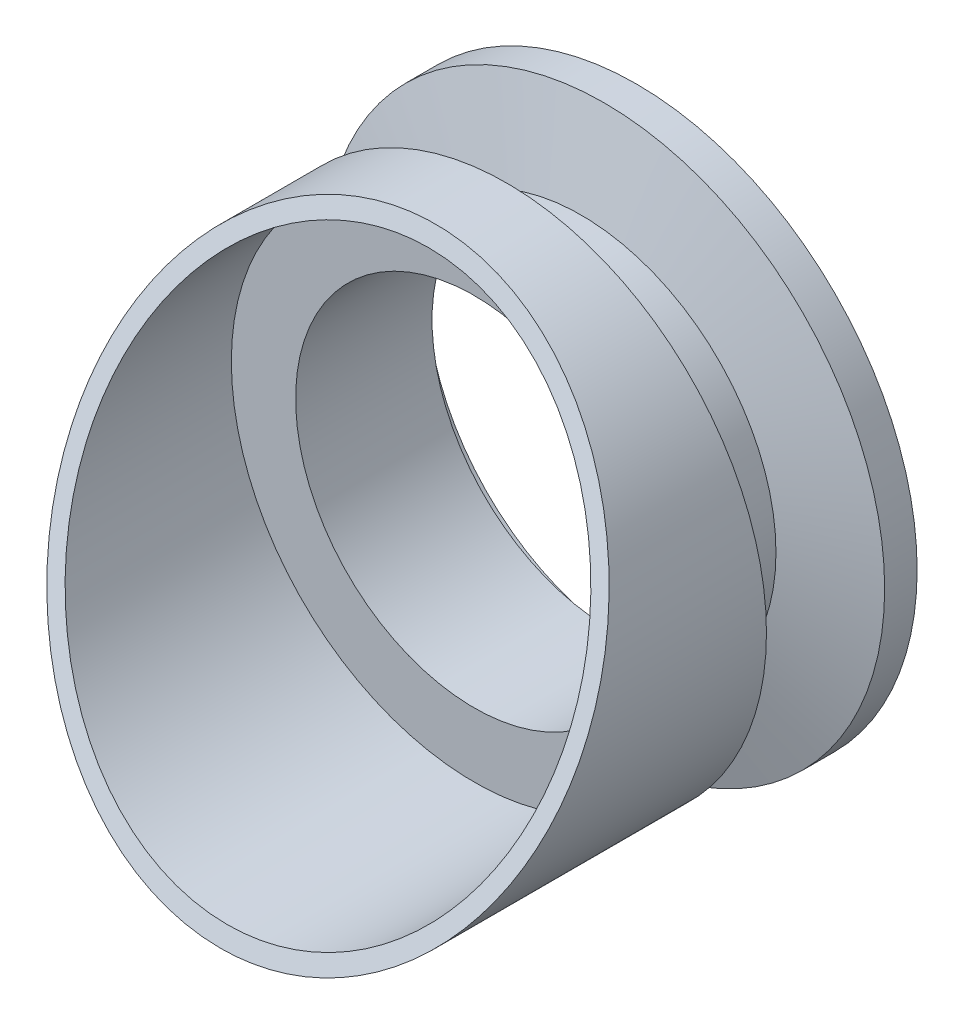
ISO-10303-21;
HEADER;
FILE_DESCRIPTION(('STEP AP214'),'2;1');
FILE_NAME('part.step','',(''),(''),'','','');
FILE_SCHEMA(('AUTOMOTIVE_DESIGN { 1 0 10303 214 1 1 1 1 }'));
ENDSEC;
DATA;
#1=APPLICATION_CONTEXT('core data for automotive mechanical design processes');
#2=APPLICATION_PROTOCOL_DEFINITION('international standard','automotive_design',2000,#1);
#3=PRODUCT_CONTEXT('',#1,'mechanical');
#4=PRODUCT('Part','Part','',(#3));
#5=PRODUCT_RELATED_PRODUCT_CATEGORY('part','',(#4));
#6=PRODUCT_DEFINITION_FORMATION('','',#4);
#7=PRODUCT_DEFINITION_CONTEXT('part definition',#1,'design');
#8=PRODUCT_DEFINITION('design','',#6,#7);
#9=PRODUCT_DEFINITION_SHAPE('','',#8);
#10=(LENGTH_UNIT() NAMED_UNIT(*) SI_UNIT(.MILLI.,.METRE.));
#11=(NAMED_UNIT(*) PLANE_ANGLE_UNIT() SI_UNIT($,.RADIAN.));
#12=(NAMED_UNIT(*) SI_UNIT($,.STERADIAN.) SOLID_ANGLE_UNIT());
#13=UNCERTAINTY_MEASURE_WITH_UNIT(LENGTH_MEASURE(1.E-05),#10,'distance_accuracy_value','');
#14=(GEOMETRIC_REPRESENTATION_CONTEXT(3) GLOBAL_UNCERTAINTY_ASSIGNED_CONTEXT((#13)) GLOBAL_UNIT_ASSIGNED_CONTEXT((#10,
#11,#12)) REPRESENTATION_CONTEXT('',''));
#15=CARTESIAN_POINT('',(0.,0.,0.));
#16=DIRECTION('',(0.,0.,1.));
#17=DIRECTION('',(1.,0.,0.));
#18=AXIS2_PLACEMENT_3D('',#15,#16,#17);
#19=CARTESIAN_POINT('',(0.,-25.4,-90.5001999999998));
#20=DIRECTION('',(0.,0.,1.));
#21=DIRECTION('',(1.,0.,0.));
#22=AXIS2_PLACEMENT_3D('',#19,#20,#21);
#23=PLANE('',#22);
#24=CARTESIAN_POINT('',(0.,-50.8,-90.5001999999998));
#25=DIRECTION('',(0.,0.,1.));
#26=DIRECTION('',(1.,0.,0.));
#27=AXIS2_PLACEMENT_3D('',#24,#25,#26);
#28=CIRCLE('',#27,25.4);
#29=CARTESIAN_POINT('',(25.4,-50.8,-90.5001999999998));
#30=VERTEX_POINT('',#29);
#31=EDGE_CURVE('E10',#30,#30,#28,.T.);
#32=ORIENTED_EDGE('',*,*,#31,.F.);
#33=EDGE_LOOP('',(#32));
#34=FACE_BOUND('',#33,.T.);
#35=CARTESIAN_POINT('',(0.,-50.8,-90.5001999999998));
#36=DIRECTION('',(0.,0.,1.));
#37=DIRECTION('',(1.,0.,0.));
#38=AXIS2_PLACEMENT_3D('',#35,#36,#37);
#39=CIRCLE('',#38,19.05);
#40=CARTESIAN_POINT('',(19.05,-50.8,-90.5001999999998));
#41=VERTEX_POINT('',#40);
#42=EDGE_CURVE('E72',#41,#41,#39,.T.);
#43=ORIENTED_EDGE('',*,*,#42,.T.);
#44=EDGE_LOOP('',(#43));
#45=FACE_BOUND('',#44,.T.);
#46=ADVANCED_FACE('F36',(#34,#45),#23,.F.);
#47=CARTESIAN_POINT('',(0.,-50.8,-87.3251999999998));
#48=DIRECTION('',(0.,0.,1.));
#49=DIRECTION('',(1.,0.,0.));
#50=AXIS2_PLACEMENT_3D('',#47,#48,#49);
#51=CYLINDRICAL_SURFACE('',#50,25.4);
#52=CARTESIAN_POINT('',(0.,-50.8,-73.0249999999998));
#53=DIRECTION('',(0.,-0.382683432365084,-0.923879532511289));
#54=DIRECTION('',(0.,-0.923879532511289,0.382683432365084));
#55=AXIS2_PLACEMENT_3D('',#52,#53,#54);
#56=ELLIPSE('',#55,27.4927618874267,25.4);
#57=CARTESIAN_POINT('',(0.,-76.2,-62.5039755157234));
#58=VERTEX_POINT('',#57);
#59=EDGE_CURVE('E75',#58,#58,#56,.T.);
#60=ORIENTED_EDGE('',*,*,#59,.T.);
#61=EDGE_LOOP('',(#60));
#62=FACE_BOUND('',#61,.T.);
#63=ORIENTED_EDGE('',*,*,#31,.T.);
#64=EDGE_LOOP('',(#63));
#65=FACE_BOUND('',#64,.T.);
#66=ADVANCED_FACE('F101',(#62,#65),#51,.T.);
#67=CARTESIAN_POINT('',(0.,-50.8,-87.3251999999998));
#68=DIRECTION('',(0.,0.,1.));
#69=DIRECTION('',(1.,0.,0.));
#70=AXIS2_PLACEMENT_3D('',#67,#68,#69);
#71=CYLINDRICAL_SURFACE('',#70,23.749);
#72=CARTESIAN_POINT('',(0.,-50.8,-73.0249999999998));
#73=DIRECTION('',(0.,-0.382683432365084,-0.923879532511289));
#74=DIRECTION('',(0.,-0.923879532511289,0.382683432365084));
#75=AXIS2_PLACEMENT_3D('',#72,#73,#74);
#76=ELLIPSE('',#75,25.705732364744,23.749);
#77=CARTESIAN_POINT('',(0.,-74.549,-63.1878421072014));
#78=VERTEX_POINT('',#77);
#79=EDGE_CURVE('E39',#78,#78,#76,.F.);
#80=ORIENTED_EDGE('',*,*,#79,.T.);
#81=EDGE_LOOP('',(#80));
#82=FACE_BOUND('',#81,.T.);
#83=CARTESIAN_POINT('',(0.,-50.8,-87.3251999999998));
#84=DIRECTION('',(0.,0.,1.));
#85=DIRECTION('',(1.,0.,0.));
#86=AXIS2_PLACEMENT_3D('',#83,#84,#85);
#87=CIRCLE('',#86,23.749);
#88=CARTESIAN_POINT('',(23.749,-50.8,-87.3251999999998));
#89=VERTEX_POINT('',#88);
#90=EDGE_CURVE('E43',#89,#89,#87,.T.);
#91=ORIENTED_EDGE('',*,*,#90,.F.);
#92=EDGE_LOOP('',(#91));
#93=FACE_BOUND('',#92,.T.);
#94=ADVANCED_FACE('F87',(#82,#93),#71,.F.);
#95=CARTESIAN_POINT('',(0.,-27.051,-87.3251999999998));
#96=DIRECTION('',(0.,0.,-1.));
#97=DIRECTION('',(-1.,0.,0.));
#98=AXIS2_PLACEMENT_3D('',#95,#96,#97);
#99=PLANE('',#98);
#100=CARTESIAN_POINT('',(0.,-50.8,-87.3251999999998));
#101=DIRECTION('',(0.,0.,1.));
#102=DIRECTION('',(1.,0.,0.));
#103=AXIS2_PLACEMENT_3D('',#100,#101,#102);
#104=CIRCLE('',#103,17.4625);
#105=CARTESIAN_POINT('',(17.4625,-50.8,-87.3251999999998));
#106=VERTEX_POINT('',#105);
#107=EDGE_CURVE('E47',#106,#106,#104,.T.);
#108=ORIENTED_EDGE('',*,*,#107,.F.);
#109=EDGE_LOOP('',(#108));
#110=FACE_BOUND('',#109,.T.);
#111=ORIENTED_EDGE('',*,*,#90,.T.);
#112=EDGE_LOOP('',(#111));
#113=FACE_BOUND('',#112,.T.);
#114=ADVANCED_FACE('F143',(#110,#113),#99,.F.);
#115=CARTESIAN_POINT('',(0.,-50.8,-87.3251999999998));
#116=DIRECTION('',(0.,0.,1.));
#117=DIRECTION('',(1.,0.,0.));
#118=AXIS2_PLACEMENT_3D('',#115,#116,#117);
#119=CYLINDRICAL_SURFACE('',#118,17.4625);
#120=CARTESIAN_POINT('',(0.,-50.8,-100.6602));
#121=DIRECTION('',(0.,0.,1.));
#122=DIRECTION('',(1.,0.,0.));
#123=AXIS2_PLACEMENT_3D('',#120,#121,#122);
#124=CIRCLE('',#123,17.4625);
#125=CARTESIAN_POINT('',(17.4625,-50.8,-100.6602));
#126=VERTEX_POINT('',#125);
#127=EDGE_CURVE('E53',#126,#126,#124,.T.);
#128=ORIENTED_EDGE('',*,*,#127,.F.);
#129=EDGE_LOOP('',(#128));
#130=FACE_BOUND('',#129,.T.);
#131=ORIENTED_EDGE('',*,*,#107,.T.);
#132=EDGE_LOOP('',(#131));
#133=FACE_BOUND('',#132,.T.);
#134=ADVANCED_FACE('F137',(#130,#133),#119,.F.);
#135=CARTESIAN_POINT('',(0.,-33.3375,-100.6602));
#136=DIRECTION('',(0.,0.,1.));
#137=DIRECTION('',(1.,0.,0.));
#138=AXIS2_PLACEMENT_3D('',#135,#136,#137);
#139=PLANE('',#138);
#140=CARTESIAN_POINT('',(0.,-50.8,-100.6602));
#141=DIRECTION('',(0.,0.,1.));
#142=DIRECTION('',(1.,0.,0.));
#143=AXIS2_PLACEMENT_3D('',#140,#141,#142);
#144=CIRCLE('',#143,20.574);
#145=CARTESIAN_POINT('',(20.574,-50.8,-100.6602));
#146=VERTEX_POINT('',#145);
#147=EDGE_CURVE('E57',#146,#146,#144,.T.);
#148=ORIENTED_EDGE('',*,*,#147,.F.);
#149=EDGE_LOOP('',(#148));
#150=FACE_BOUND('',#149,.T.);
#151=ORIENTED_EDGE('',*,*,#127,.T.);
#152=EDGE_LOOP('',(#151));
#153=FACE_BOUND('',#152,.T.);
#154=ADVANCED_FACE('F131',(#150,#153),#139,.F.);
#155=CARTESIAN_POINT('',(0.,-50.8,-87.3251999999998));
#156=DIRECTION('',(0.,0.,1.));
#157=DIRECTION('',(1.,0.,0.));
#158=AXIS2_PLACEMENT_3D('',#155,#156,#157);
#159=CYLINDRICAL_SURFACE('',#158,20.574);
#160=CARTESIAN_POINT('',(0.,-50.8,-103.2002));
#161=DIRECTION('',(0.,0.,1.));
#162=DIRECTION('',(1.,0.,0.));
#163=AXIS2_PLACEMENT_3D('',#160,#161,#162);
#164=CIRCLE('',#163,20.574);
#165=CARTESIAN_POINT('',(20.574,-50.8,-103.2002));
#166=VERTEX_POINT('',#165);
#167=EDGE_CURVE('E60',#166,#166,#164,.T.);
#168=ORIENTED_EDGE('',*,*,#167,.F.);
#169=EDGE_LOOP('',(#168));
#170=FACE_BOUND('',#169,.T.);
#171=ORIENTED_EDGE('',*,*,#147,.T.);
#172=EDGE_LOOP('',(#171));
#173=FACE_BOUND('',#172,.T.);
#174=ADVANCED_FACE('F125',(#170,#173),#159,.F.);
#175=CARTESIAN_POINT('',(0.,-30.226,-103.2002));
#176=DIRECTION('',(0.,0.,1.));
#177=DIRECTION('',(1.,0.,0.));
#178=AXIS2_PLACEMENT_3D('',#175,#176,#177);
#179=PLANE('',#178);
#180=CARTESIAN_POINT('',(0.,-50.8,-103.2002));
#181=DIRECTION('',(0.,0.,1.));
#182=DIRECTION('',(1.,0.,0.));
#183=AXIS2_PLACEMENT_3D('',#180,#181,#182);
#184=CIRCLE('',#183,27.432);
#185=CARTESIAN_POINT('',(27.432,-50.8,-103.2002));
#186=VERTEX_POINT('',#185);
#187=EDGE_CURVE('E63',#186,#186,#184,.T.);
#188=ORIENTED_EDGE('',*,*,#187,.F.);
#189=EDGE_LOOP('',(#188));
#190=FACE_BOUND('',#189,.T.);
#191=ORIENTED_EDGE('',*,*,#167,.T.);
#192=EDGE_LOOP('',(#191));
#193=FACE_BOUND('',#192,.T.);
#194=ADVANCED_FACE('F119',(#190,#193),#179,.F.);
#195=CARTESIAN_POINT('',(0.,-50.8,-87.3251999999998));
#196=DIRECTION('',(0.,0.,1.));
#197=DIRECTION('',(1.,0.,0.));
#198=AXIS2_PLACEMENT_3D('',#195,#196,#197);
#199=CYLINDRICAL_SURFACE('',#198,27.432);
#200=CARTESIAN_POINT('',(0.,-50.8,-100.0252));
#201=DIRECTION('',(0.,0.,1.));
#202=DIRECTION('',(1.,0.,0.));
#203=AXIS2_PLACEMENT_3D('',#200,#201,#202);
#204=CIRCLE('',#203,27.432);
#205=CARTESIAN_POINT('',(27.432,-50.8,-100.0252));
#206=VERTEX_POINT('',#205);
#207=EDGE_CURVE('E66',#206,#206,#204,.T.);
#208=ORIENTED_EDGE('',*,*,#207,.F.);
#209=EDGE_LOOP('',(#208));
#210=FACE_BOUND('',#209,.T.);
#211=ORIENTED_EDGE('',*,*,#187,.T.);
#212=EDGE_LOOP('',(#211));
#213=FACE_BOUND('',#212,.T.);
#214=ADVANCED_FACE('F113',(#210,#213),#199,.T.);
#215=CARTESIAN_POINT('',(0.,-50.8,-100.0252));
#216=DIRECTION('',(0.,0.,-1.));
#217=DIRECTION('',(-1.,0.,0.));
#218=AXIS2_PLACEMENT_3D('',#215,#216,#217);
#219=CONICAL_SURFACE('',#218,27.432,1.30899693899575);
#220=CARTESIAN_POINT('',(0.,-50.8,-97.7792498690423));
#221=DIRECTION('',(0.,0.,1.));
#222=DIRECTION('',(1.,0.,0.));
#223=AXIS2_PLACEMENT_3D('',#220,#221,#222);
#224=CIRCLE('',#223,19.05);
#225=CARTESIAN_POINT('',(19.05,-50.8,-97.7792498690423));
#226=VERTEX_POINT('',#225);
#227=EDGE_CURVE('E69',#226,#226,#224,.T.);
#228=ORIENTED_EDGE('',*,*,#227,.F.);
#229=EDGE_LOOP('',(#228));
#230=FACE_BOUND('',#229,.T.);
#231=ORIENTED_EDGE('',*,*,#207,.T.);
#232=EDGE_LOOP('',(#231));
#233=FACE_BOUND('',#232,.T.);
#234=ADVANCED_FACE('F97',(#230,#233),#219,.T.);
#235=CARTESIAN_POINT('',(0.,-50.8,-87.3251999999998));
#236=DIRECTION('',(0.,0.,1.));
#237=DIRECTION('',(1.,0.,0.));
#238=AXIS2_PLACEMENT_3D('',#235,#236,#237);
#239=CYLINDRICAL_SURFACE('',#238,19.05);
#240=ORIENTED_EDGE('',*,*,#42,.F.);
#241=EDGE_LOOP('',(#240));
#242=FACE_BOUND('',#241,.T.);
#243=ORIENTED_EDGE('',*,*,#227,.T.);
#244=EDGE_LOOP('',(#243));
#245=FACE_BOUND('',#244,.T.);
#246=ADVANCED_FACE('F93',(#242,#245),#239,.T.);
#247=CARTESIAN_POINT('',(-27.432,-88.2813728836567,-57.4997070152264));
#248=DIRECTION('',(0.,-0.382683432365084,-0.923879532511289));
#249=DIRECTION('',(0.,0.923879532511289,-0.382683432365084));
#250=AXIS2_PLACEMENT_3D('',#247,#248,#249);
#251=PLANE('',#250);
#252=ORIENTED_EDGE('',*,*,#79,.F.);
#253=EDGE_LOOP('',(#252));
#254=FACE_BOUND('',#253,.T.);
#255=ORIENTED_EDGE('',*,*,#59,.F.);
#256=EDGE_LOOP('',(#255));
#257=FACE_BOUND('',#256,.T.);
#258=ADVANCED_FACE('F90',(#254,#257),#251,.F.);
#259=CLOSED_SHELL('',(#46,#66,#94,#114,#134,#154,#174,#194,#214,#234,#246,#258));
#260=MANIFOLD_SOLID_BREP('B2',#259);
#261=ADVANCED_BREP_SHAPE_REPRESENTATION('',(#18,#260),#14);
#262=SHAPE_DEFINITION_REPRESENTATION(#9,#261);
ENDSEC;
END-ISO-10303-21;
